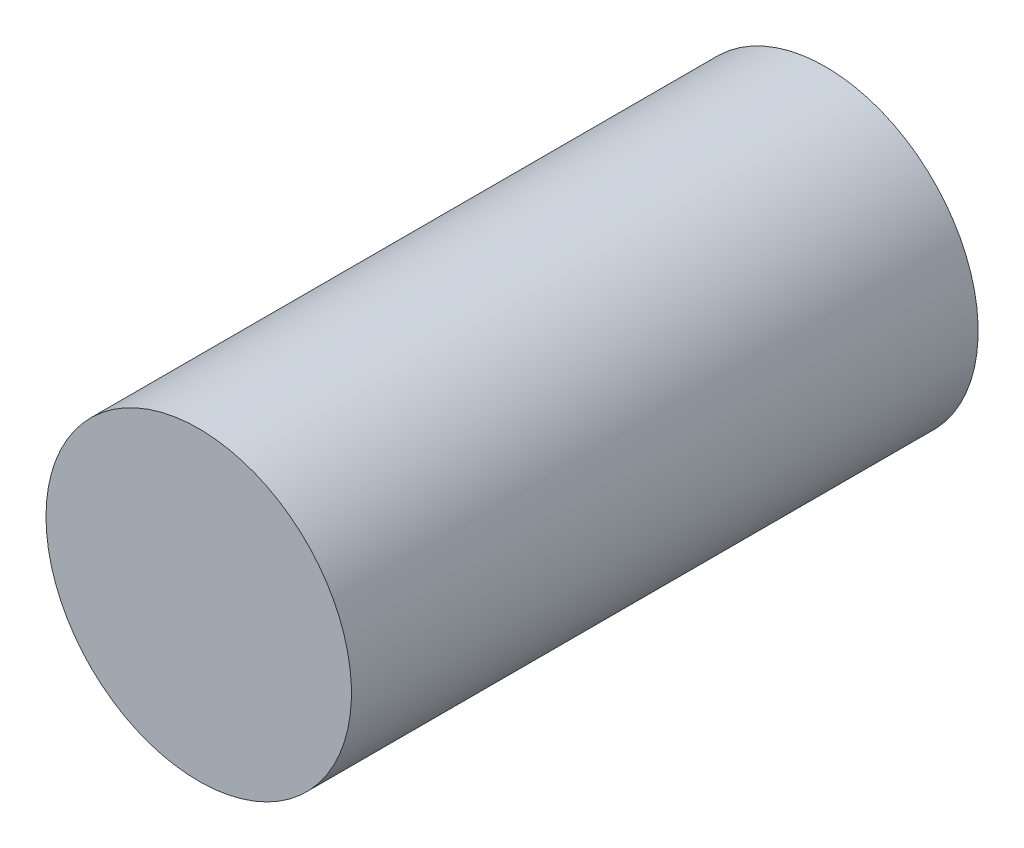
ISO-10303-21;
HEADER;
FILE_DESCRIPTION(('STEP AP214'),'2;1');
FILE_NAME('part.step','',(''),(''),'','','');
FILE_SCHEMA(('AUTOMOTIVE_DESIGN { 1 0 10303 214 1 1 1 1 }'));
ENDSEC;
DATA;
#1=APPLICATION_CONTEXT('core data for automotive mechanical design processes');
#2=APPLICATION_PROTOCOL_DEFINITION('international standard','automotive_design',2000,#1);
#3=PRODUCT_CONTEXT('',#1,'mechanical');
#4=PRODUCT('Part','Part','',(#3));
#5=PRODUCT_RELATED_PRODUCT_CATEGORY('part','',(#4));
#6=PRODUCT_DEFINITION_FORMATION('','',#4);
#7=PRODUCT_DEFINITION_CONTEXT('part definition',#1,'design');
#8=PRODUCT_DEFINITION('design','',#6,#7);
#9=PRODUCT_DEFINITION_SHAPE('','',#8);
#10=(LENGTH_UNIT() NAMED_UNIT(*) SI_UNIT(.MILLI.,.METRE.));
#11=(NAMED_UNIT(*) PLANE_ANGLE_UNIT() SI_UNIT($,.RADIAN.));
#12=(NAMED_UNIT(*) SI_UNIT($,.STERADIAN.) SOLID_ANGLE_UNIT());
#13=UNCERTAINTY_MEASURE_WITH_UNIT(LENGTH_MEASURE(1.E-05),#10,'distance_accuracy_value','');
#14=(GEOMETRIC_REPRESENTATION_CONTEXT(3) GLOBAL_UNCERTAINTY_ASSIGNED_CONTEXT((#13)) GLOBAL_UNIT_ASSIGNED_CONTEXT((#10,
#11,#12)) REPRESENTATION_CONTEXT('',''));
#15=CARTESIAN_POINT('',(0.,0.,0.));
#16=DIRECTION('',(0.,0.,1.));
#17=DIRECTION('',(1.,0.,0.));
#18=AXIS2_PLACEMENT_3D('',#15,#16,#17);
#19=CARTESIAN_POINT('',(6.35,0.,0.));
#20=DIRECTION('',(0.,0.,-1.));
#21=DIRECTION('',(-1.,0.,0.));
#22=AXIS2_PLACEMENT_3D('',#19,#20,#21);
#23=PLANE('',#22);
#24=CARTESIAN_POINT('',(0.,0.,0.));
#25=DIRECTION('',(0.,0.,-1.));
#26=DIRECTION('',(-1.,0.,0.));
#27=AXIS2_PLACEMENT_3D('',#24,#25,#26);
#28=CIRCLE('',#27,6.35);
#29=CARTESIAN_POINT('',(-6.35,0.,0.));
#30=VERTEX_POINT('',#29);
#31=EDGE_CURVE('E18',#30,#30,#28,.F.);
#32=ORIENTED_EDGE('',*,*,#31,.F.);
#33=EDGE_LOOP('',(#32));
#34=FACE_BOUND('',#33,.T.);
#35=ADVANCED_FACE('F15',(#34),#23,.T.);
#36=CARTESIAN_POINT('',(6.35,0.,26.0604));
#37=DIRECTION('',(0.,0.,-1.));
#38=DIRECTION('',(-1.,0.,0.));
#39=AXIS2_PLACEMENT_3D('',#36,#37,#38);
#40=PLANE('',#39);
#41=CARTESIAN_POINT('',(0.,0.,26.0604));
#42=DIRECTION('',(0.,0.,-1.));
#43=DIRECTION('',(-1.,0.,0.));
#44=AXIS2_PLACEMENT_3D('',#41,#42,#43);
#45=CIRCLE('',#44,6.35);
#46=CARTESIAN_POINT('',(-6.35,0.,26.0604));
#47=VERTEX_POINT('',#46);
#48=EDGE_CURVE('E10',#47,#47,#45,.T.);
#49=ORIENTED_EDGE('',*,*,#48,.F.);
#50=EDGE_LOOP('',(#49));
#51=FACE_BOUND('',#50,.T.);
#52=ADVANCED_FACE('F30',(#51),#40,.F.);
#53=CARTESIAN_POINT('',(0.,0.,0.));
#54=DIRECTION('',(0.,0.,-1.));
#55=DIRECTION('',(-1.,0.,0.));
#56=AXIS2_PLACEMENT_3D('',#53,#54,#55);
#57=CYLINDRICAL_SURFACE('',#56,6.35);
#58=ORIENTED_EDGE('',*,*,#31,.T.);
#59=EDGE_LOOP('',(#58));
#60=FACE_BOUND('',#59,.T.);
#61=ORIENTED_EDGE('',*,*,#48,.T.);
#62=EDGE_LOOP('',(#61));
#63=FACE_BOUND('',#62,.T.);
#64=ADVANCED_FACE('F27',(#60,#63),#57,.T.);
#65=CLOSED_SHELL('',(#35,#52,#64));
#66=MANIFOLD_SOLID_BREP('B1',#65);
#67=ADVANCED_BREP_SHAPE_REPRESENTATION('',(#18,#66),#14);
#68=SHAPE_DEFINITION_REPRESENTATION(#9,#67);
ENDSEC;
END-ISO-10303-21;
